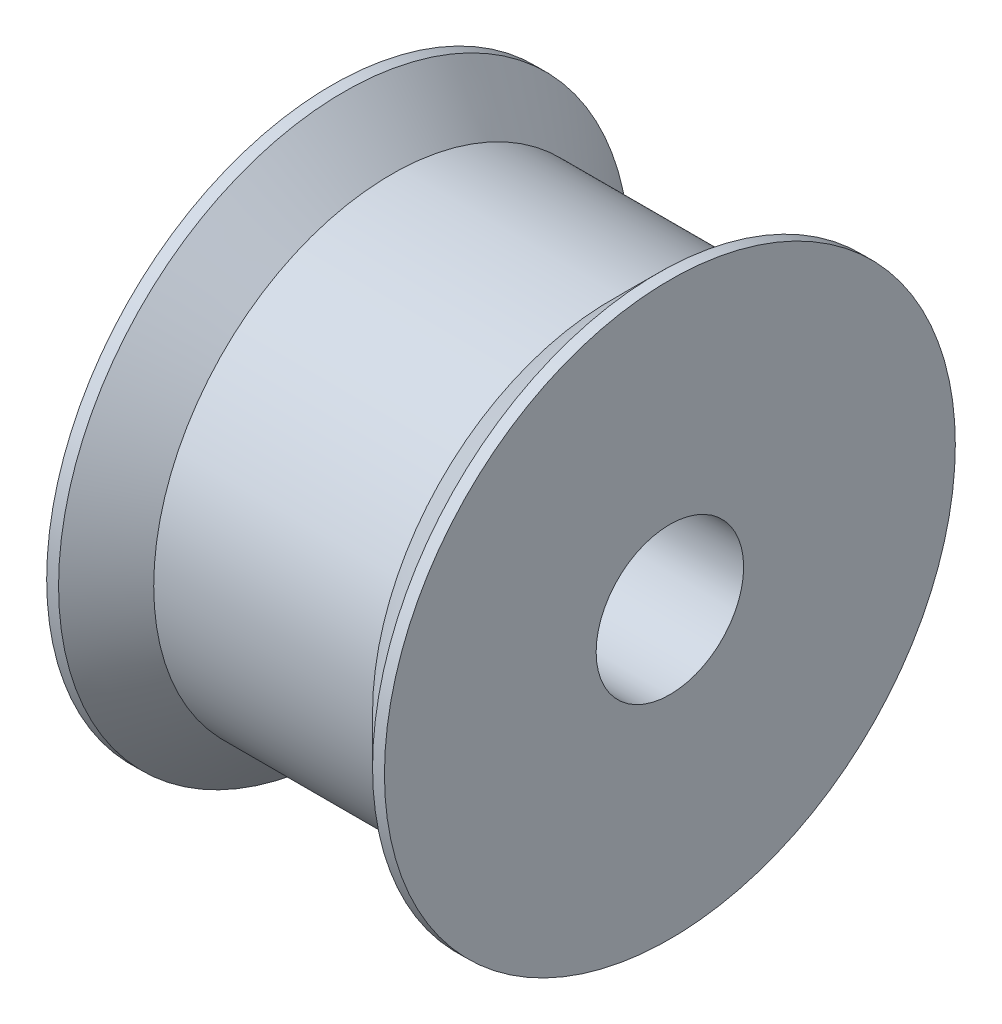
ISO-10303-21;
HEADER;
FILE_DESCRIPTION(('STEP AP214'),'2;1');
FILE_NAME('part.step','',(''),(''),'','','');
FILE_SCHEMA(('AUTOMOTIVE_DESIGN { 1 0 10303 214 1 1 1 1 }'));
ENDSEC;
DATA;
#1=APPLICATION_CONTEXT('core data for automotive mechanical design processes');
#2=APPLICATION_PROTOCOL_DEFINITION('international standard','automotive_design',2000,#1);
#3=PRODUCT_CONTEXT('',#1,'mechanical');
#4=PRODUCT('Part','Part','',(#3));
#5=PRODUCT_RELATED_PRODUCT_CATEGORY('part','',(#4));
#6=PRODUCT_DEFINITION_FORMATION('','',#4);
#7=PRODUCT_DEFINITION_CONTEXT('part definition',#1,'design');
#8=PRODUCT_DEFINITION('design','',#6,#7);
#9=PRODUCT_DEFINITION_SHAPE('','',#8);
#10=(LENGTH_UNIT() NAMED_UNIT(*) SI_UNIT(.MILLI.,.METRE.));
#11=(NAMED_UNIT(*) PLANE_ANGLE_UNIT() SI_UNIT($,.RADIAN.));
#12=(NAMED_UNIT(*) SI_UNIT($,.STERADIAN.) SOLID_ANGLE_UNIT());
#13=UNCERTAINTY_MEASURE_WITH_UNIT(LENGTH_MEASURE(1.E-05),#10,'distance_accuracy_value','');
#14=(GEOMETRIC_REPRESENTATION_CONTEXT(3) GLOBAL_UNCERTAINTY_ASSIGNED_CONTEXT((#13)) GLOBAL_UNIT_ASSIGNED_CONTEXT((#10,
#11,#12)) REPRESENTATION_CONTEXT('',''));
#15=CARTESIAN_POINT('',(0.,0.,0.));
#16=DIRECTION('',(0.,0.,1.));
#17=DIRECTION('',(1.,0.,0.));
#18=AXIS2_PLACEMENT_3D('',#15,#16,#17);
#19=CARTESIAN_POINT('',(-7.1,0.,-12.));
#20=DIRECTION('',(-1.,0.,0.));
#21=DIRECTION('',(0.,0.,1.));
#22=AXIS2_PLACEMENT_3D('',#19,#20,#21);
#23=PLANE('',#22);
#24=CARTESIAN_POINT('',(-7.1,0.,0.));
#25=DIRECTION('',(-1.,0.,0.));
#26=DIRECTION('',(0.,0.,1.));
#27=AXIS2_PLACEMENT_3D('',#24,#25,#26);
#28=CIRCLE('',#27,3.1);
#29=CARTESIAN_POINT('',(-7.1,0.,3.1));
#30=VERTEX_POINT('',#29);
#31=EDGE_CURVE('E60',#30,#30,#28,.T.);
#32=ORIENTED_EDGE('',*,*,#31,.F.);
#33=EDGE_LOOP('',(#32));
#34=FACE_BOUND('',#33,.T.);
#35=CARTESIAN_POINT('',(-7.1,0.,0.));
#36=DIRECTION('',(1.,0.,0.));
#37=DIRECTION('',(0.,0.,-1.));
#38=AXIS2_PLACEMENT_3D('',#35,#36,#37);
#39=CIRCLE('',#38,12.);
#40=CARTESIAN_POINT('',(-7.1,0.,-12.));
#41=VERTEX_POINT('',#40);
#42=EDGE_CURVE('E10',#41,#41,#39,.T.);
#43=ORIENTED_EDGE('',*,*,#42,.F.);
#44=EDGE_LOOP('',(#43));
#45=FACE_BOUND('',#44,.T.);
#46=ADVANCED_FACE('F32',(#34,#45),#23,.T.);
#47=CARTESIAN_POINT('',(7.1,0.,0.));
#48=DIRECTION('',(1.,0.,0.));
#49=DIRECTION('',(0.,0.,-1.));
#50=AXIS2_PLACEMENT_3D('',#47,#48,#49);
#51=CYLINDRICAL_SURFACE('',#50,12.);
#52=ORIENTED_EDGE('',*,*,#42,.T.);
#53=EDGE_LOOP('',(#52));
#54=FACE_BOUND('',#53,.T.);
#55=CARTESIAN_POINT('',(-6.60000000000001,0.,0.));
#56=DIRECTION('',(1.,0.,0.));
#57=DIRECTION('',(0.,0.,-1.));
#58=AXIS2_PLACEMENT_3D('',#55,#56,#57);
#59=CIRCLE('',#58,12.);
#60=CARTESIAN_POINT('',(-6.60000000000001,0.,-12.));
#61=VERTEX_POINT('',#60);
#62=EDGE_CURVE('E38',#61,#61,#59,.T.);
#63=ORIENTED_EDGE('',*,*,#62,.F.);
#64=EDGE_LOOP('',(#63));
#65=FACE_BOUND('',#64,.T.);
#66=ADVANCED_FACE('F69',(#54,#65),#51,.T.);
#67=CARTESIAN_POINT('',(-4.6,0.,0.));
#68=DIRECTION('',(-1.,0.,0.));
#69=DIRECTION('',(0.,0.,1.));
#70=AXIS2_PLACEMENT_3D('',#67,#68,#69);
#71=CONICAL_SURFACE('',#70,10.,0.785398163397447);
#72=ORIENTED_EDGE('',*,*,#62,.T.);
#73=EDGE_LOOP('',(#72));
#74=FACE_BOUND('',#73,.T.);
#75=CARTESIAN_POINT('',(-4.6,0.,0.));
#76=DIRECTION('',(1.,0.,0.));
#77=DIRECTION('',(0.,0.,-1.));
#78=AXIS2_PLACEMENT_3D('',#75,#76,#77);
#79=CIRCLE('',#78,10.);
#80=CARTESIAN_POINT('',(-4.6,0.,-9.99999999999999));
#81=VERTEX_POINT('',#80);
#82=EDGE_CURVE('E42',#81,#81,#79,.T.);
#83=ORIENTED_EDGE('',*,*,#82,.F.);
#84=EDGE_LOOP('',(#83));
#85=FACE_BOUND('',#84,.T.);
#86=ADVANCED_FACE('F73',(#74,#85),#71,.T.);
#87=CARTESIAN_POINT('',(7.1,0.,0.));
#88=DIRECTION('',(1.,0.,0.));
#89=DIRECTION('',(0.,0.,-1.));
#90=AXIS2_PLACEMENT_3D('',#87,#88,#89);
#91=CYLINDRICAL_SURFACE('',#90,10.);
#92=ORIENTED_EDGE('',*,*,#82,.T.);
#93=EDGE_LOOP('',(#92));
#94=FACE_BOUND('',#93,.T.);
#95=CARTESIAN_POINT('',(4.6,0.,0.));
#96=DIRECTION('',(1.,0.,0.));
#97=DIRECTION('',(0.,0.,-1.));
#98=AXIS2_PLACEMENT_3D('',#95,#96,#97);
#99=CIRCLE('',#98,10.);
#100=CARTESIAN_POINT('',(4.6,0.,-9.99999999999999));
#101=VERTEX_POINT('',#100);
#102=EDGE_CURVE('E46',#101,#101,#99,.T.);
#103=ORIENTED_EDGE('',*,*,#102,.F.);
#104=EDGE_LOOP('',(#103));
#105=FACE_BOUND('',#104,.T.);
#106=ADVANCED_FACE('F77',(#94,#105),#91,.T.);
#107=CARTESIAN_POINT('',(6.60000000000001,0.,0.));
#108=DIRECTION('',(1.,0.,0.));
#109=DIRECTION('',(0.,0.,-1.));
#110=AXIS2_PLACEMENT_3D('',#107,#108,#109);
#111=CONICAL_SURFACE('',#110,12.,0.785398163397447);
#112=ORIENTED_EDGE('',*,*,#102,.T.);
#113=EDGE_LOOP('',(#112));
#114=FACE_BOUND('',#113,.T.);
#115=CARTESIAN_POINT('',(6.60000000000001,0.,0.));
#116=DIRECTION('',(1.,0.,0.));
#117=DIRECTION('',(0.,0.,-1.));
#118=AXIS2_PLACEMENT_3D('',#115,#116,#117);
#119=CIRCLE('',#118,12.);
#120=CARTESIAN_POINT('',(6.60000000000001,0.,-12.));
#121=VERTEX_POINT('',#120);
#122=EDGE_CURVE('E51',#121,#121,#119,.T.);
#123=ORIENTED_EDGE('',*,*,#122,.F.);
#124=EDGE_LOOP('',(#123));
#125=FACE_BOUND('',#124,.T.);
#126=ADVANCED_FACE('F83',(#114,#125),#111,.T.);
#127=CARTESIAN_POINT('',(7.1,0.,0.));
#128=DIRECTION('',(1.,0.,0.));
#129=DIRECTION('',(0.,0.,-1.));
#130=AXIS2_PLACEMENT_3D('',#127,#128,#129);
#131=CYLINDRICAL_SURFACE('',#130,12.);
#132=ORIENTED_EDGE('',*,*,#122,.T.);
#133=EDGE_LOOP('',(#132));
#134=FACE_BOUND('',#133,.T.);
#135=CARTESIAN_POINT('',(7.1,0.,0.));
#136=DIRECTION('',(1.,0.,0.));
#137=DIRECTION('',(0.,0.,-1.));
#138=AXIS2_PLACEMENT_3D('',#135,#136,#137);
#139=CIRCLE('',#138,12.);
#140=CARTESIAN_POINT('',(7.1,0.,-12.));
#141=VERTEX_POINT('',#140);
#142=EDGE_CURVE('E54',#141,#141,#139,.T.);
#143=ORIENTED_EDGE('',*,*,#142,.F.);
#144=EDGE_LOOP('',(#143));
#145=FACE_BOUND('',#144,.T.);
#146=ADVANCED_FACE('F87',(#134,#145),#131,.T.);
#147=CARTESIAN_POINT('',(7.1,0.,-12.));
#148=DIRECTION('',(1.,0.,0.));
#149=DIRECTION('',(0.,0.,-1.));
#150=AXIS2_PLACEMENT_3D('',#147,#148,#149);
#151=PLANE('',#150);
#152=CARTESIAN_POINT('',(7.1,0.,0.));
#153=DIRECTION('',(1.,0.,0.));
#154=DIRECTION('',(0.,0.,-1.));
#155=AXIS2_PLACEMENT_3D('',#152,#153,#154);
#156=CIRCLE('',#155,3.1);
#157=CARTESIAN_POINT('',(7.1,0.,-3.1));
#158=VERTEX_POINT('',#157);
#159=EDGE_CURVE('E57',#158,#158,#156,.F.);
#160=ORIENTED_EDGE('',*,*,#159,.T.);
#161=EDGE_LOOP('',(#160));
#162=FACE_BOUND('',#161,.T.);
#163=ORIENTED_EDGE('',*,*,#142,.T.);
#164=EDGE_LOOP('',(#163));
#165=FACE_BOUND('',#164,.T.);
#166=ADVANCED_FACE('F91',(#162,#165),#151,.T.);
#167=CARTESIAN_POINT('',(15.8681240867132,0.,0.));
#168=DIRECTION('',(-1.,0.,0.));
#169=DIRECTION('',(0.,0.,1.));
#170=AXIS2_PLACEMENT_3D('',#167,#168,#169);
#171=CYLINDRICAL_SURFACE('',#170,3.1);
#172=ORIENTED_EDGE('',*,*,#31,.T.);
#173=EDGE_LOOP('',(#172));
#174=FACE_BOUND('',#173,.T.);
#175=ORIENTED_EDGE('',*,*,#159,.F.);
#176=EDGE_LOOP('',(#175));
#177=FACE_BOUND('',#176,.T.);
#178=ADVANCED_FACE('F64',(#174,#177),#171,.F.);
#179=CLOSED_SHELL('',(#46,#66,#86,#106,#126,#146,#166,#178));
#180=MANIFOLD_SOLID_BREP('B2',#179);
#181=ADVANCED_BREP_SHAPE_REPRESENTATION('',(#18,#180),#14);
#182=SHAPE_DEFINITION_REPRESENTATION(#9,#181);
ENDSEC;
END-ISO-10303-21;
